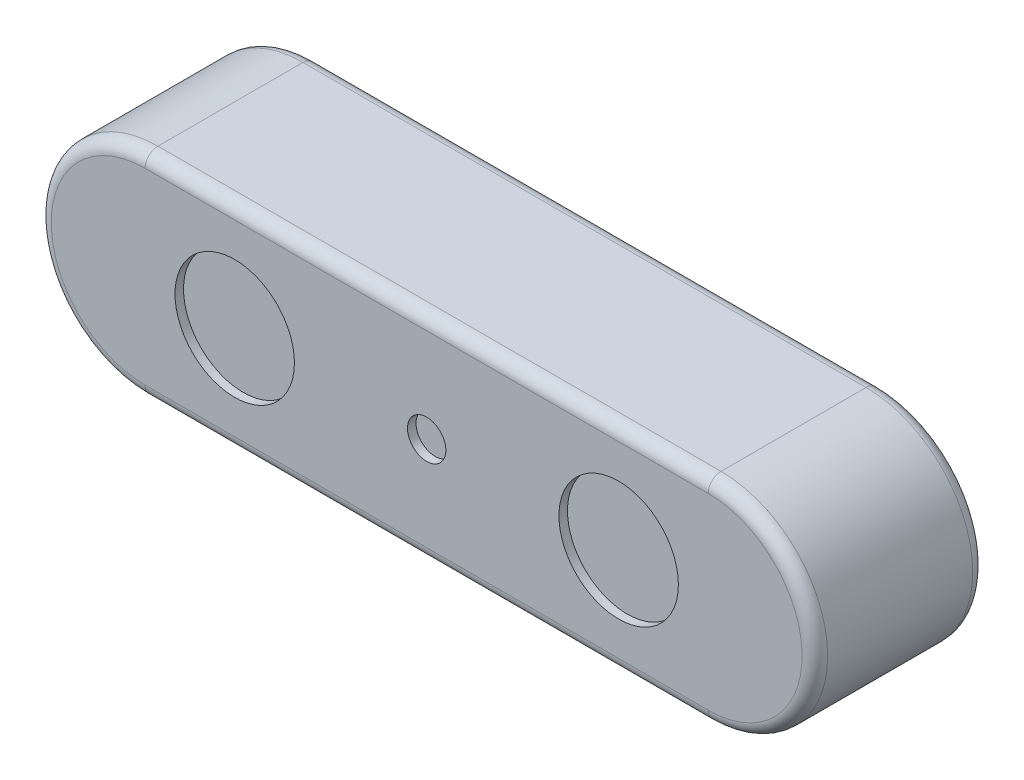
ISO-10303-21;
HEADER;
FILE_DESCRIPTION(('STEP AP214'),'2;1');
FILE_NAME('part.step','',(''),(''),'','','');
FILE_SCHEMA(('AUTOMOTIVE_DESIGN { 1 0 10303 214 1 1 1 1 }'));
ENDSEC;
DATA;
#1=APPLICATION_CONTEXT('core data for automotive mechanical design processes');
#2=APPLICATION_PROTOCOL_DEFINITION('international standard','automotive_design',2000,#1);
#3=PRODUCT_CONTEXT('',#1,'mechanical');
#4=PRODUCT('Part','Part','',(#3));
#5=PRODUCT_RELATED_PRODUCT_CATEGORY('part','',(#4));
#6=PRODUCT_DEFINITION_FORMATION('','',#4);
#7=PRODUCT_DEFINITION_CONTEXT('part definition',#1,'design');
#8=PRODUCT_DEFINITION('design','',#6,#7);
#9=PRODUCT_DEFINITION_SHAPE('','',#8);
#10=(LENGTH_UNIT() NAMED_UNIT(*) SI_UNIT(.MILLI.,.METRE.));
#11=(NAMED_UNIT(*) PLANE_ANGLE_UNIT() SI_UNIT($,.RADIAN.));
#12=(NAMED_UNIT(*) SI_UNIT($,.STERADIAN.) SOLID_ANGLE_UNIT());
#13=UNCERTAINTY_MEASURE_WITH_UNIT(LENGTH_MEASURE(1.E-05),#10,'distance_accuracy_value','');
#14=(GEOMETRIC_REPRESENTATION_CONTEXT(3) GLOBAL_UNCERTAINTY_ASSIGNED_CONTEXT((#13)) GLOBAL_UNIT_ASSIGNED_CONTEXT((#10,
#11,#12)) REPRESENTATION_CONTEXT('',''));
#15=CARTESIAN_POINT('',(0.,0.,0.));
#16=DIRECTION('',(0.,0.,1.));
#17=DIRECTION('',(1.,0.,0.));
#18=AXIS2_PLACEMENT_3D('',#15,#16,#17);
#19=CARTESIAN_POINT('',(33.,0.,20.));
#20=DIRECTION('',(0.,0.,-1.));
#21=DIRECTION('',(-1.,0.,0.));
#22=AXIS2_PLACEMENT_3D('',#19,#20,#21);
#23=CYLINDRICAL_SURFACE('',#22,12.5);
#24=DIRECTION('',(0.,0.,-1.));
#25=VECTOR('',#24,1.);
#26=CARTESIAN_POINT('',(33.,-12.5,20.));
#27=LINE('',#26,#25);
#28=CARTESIAN_POINT('',(33.,-12.5,18.5));
#29=VERTEX_POINT('',#28);
#30=CARTESIAN_POINT('',(33.,-12.5,1.5));
#31=VERTEX_POINT('',#30);
#32=EDGE_CURVE('E164',#29,#31,#27,.T.);
#33=ORIENTED_EDGE('',*,*,#32,.T.);
#34=CARTESIAN_POINT('',(33.,0.,1.5));
#35=DIRECTION('',(0.,0.,1.));
#36=DIRECTION('',(1.,0.,0.));
#37=AXIS2_PLACEMENT_3D('',#34,#35,#36);
#38=CIRCLE('',#37,12.5);
#39=CARTESIAN_POINT('',(33.,12.5,1.5));
#40=VERTEX_POINT('',#39);
#41=EDGE_CURVE('E126',#31,#40,#38,.T.);
#42=ORIENTED_EDGE('',*,*,#41,.T.);
#43=DIRECTION('',(0.,0.,-1.));
#44=VECTOR('',#43,1.);
#45=CARTESIAN_POINT('',(33.,12.5,20.));
#46=LINE('',#45,#44);
#47=CARTESIAN_POINT('',(33.,12.5,18.5));
#48=VERTEX_POINT('',#47);
#49=EDGE_CURVE('E109',#48,#40,#46,.T.);
#50=ORIENTED_EDGE('',*,*,#49,.F.);
#51=CARTESIAN_POINT('',(33.,0.,18.5));
#52=DIRECTION('',(0.,0.,1.));
#53=DIRECTION('',(1.,0.,0.));
#54=AXIS2_PLACEMENT_3D('',#51,#52,#53);
#55=CIRCLE('',#54,12.5);
#56=EDGE_CURVE('E123',#48,#29,#55,.F.);
#57=ORIENTED_EDGE('',*,*,#56,.T.);
#58=EDGE_LOOP('',(#33,#42,#50,#57));
#59=FACE_BOUND('',#58,.T.);
#60=ADVANCED_FACE('F40',(#59),#23,.T.);
#61=CARTESIAN_POINT('',(-33.,12.5,20.));
#62=DIRECTION('',(0.,-1.,0.));
#63=DIRECTION('',(0.,0.,-1.));
#64=AXIS2_PLACEMENT_3D('',#61,#62,#63);
#65=PLANE('',#64);
#66=ORIENTED_EDGE('',*,*,#49,.T.);
#67=DIRECTION('',(-1.,0.,0.));
#68=VECTOR('',#67,1.);
#69=CARTESIAN_POINT('',(-33.,12.5,1.5));
#70=LINE('',#69,#68);
#71=CARTESIAN_POINT('',(-33.,12.5,1.5));
#72=VERTEX_POINT('',#71);
#73=EDGE_CURVE('E11',#40,#72,#70,.T.);
#74=ORIENTED_EDGE('',*,*,#73,.T.);
#75=DIRECTION('',(0.,0.,-1.));
#76=VECTOR('',#75,1.);
#77=CARTESIAN_POINT('',(-33.,12.5,20.));
#78=LINE('',#77,#76);
#79=CARTESIAN_POINT('',(-33.,12.5,18.5));
#80=VERTEX_POINT('',#79);
#81=EDGE_CURVE('E111',#80,#72,#78,.T.);
#82=ORIENTED_EDGE('',*,*,#81,.F.);
#83=DIRECTION('',(-1.,0.,0.));
#84=VECTOR('',#83,1.);
#85=CARTESIAN_POINT('',(33.,12.5,18.5));
#86=LINE('',#85,#84);
#87=EDGE_CURVE('E49',#80,#48,#86,.F.);
#88=ORIENTED_EDGE('',*,*,#87,.T.);
#89=EDGE_LOOP('',(#66,#74,#82,#88));
#90=FACE_BOUND('',#89,.T.);
#91=ADVANCED_FACE('F108',(#90),#65,.F.);
#92=CARTESIAN_POINT('',(-33.,0.,20.));
#93=DIRECTION('',(0.,0.,-1.));
#94=DIRECTION('',(-1.,0.,0.));
#95=AXIS2_PLACEMENT_3D('',#92,#93,#94);
#96=CYLINDRICAL_SURFACE('',#95,12.5);
#97=ORIENTED_EDGE('',*,*,#81,.T.);
#98=CARTESIAN_POINT('',(-33.,0.,1.5));
#99=DIRECTION('',(0.,0.,1.));
#100=DIRECTION('',(1.,0.,0.));
#101=AXIS2_PLACEMENT_3D('',#98,#99,#100);
#102=CIRCLE('',#101,12.5);
#103=CARTESIAN_POINT('',(-33.,-12.5,1.5));
#104=VERTEX_POINT('',#103);
#105=EDGE_CURVE('E195',#72,#104,#102,.T.);
#106=ORIENTED_EDGE('',*,*,#105,.T.);
#107=DIRECTION('',(0.,0.,-1.));
#108=VECTOR('',#107,1.);
#109=CARTESIAN_POINT('',(-33.,-12.5,20.));
#110=LINE('',#109,#108);
#111=CARTESIAN_POINT('',(-33.,-12.5,18.5));
#112=VERTEX_POINT('',#111);
#113=EDGE_CURVE('E169',#112,#104,#110,.T.);
#114=ORIENTED_EDGE('',*,*,#113,.F.);
#115=CARTESIAN_POINT('',(-33.,0.,18.5));
#116=DIRECTION('',(0.,0.,1.));
#117=DIRECTION('',(1.,0.,0.));
#118=AXIS2_PLACEMENT_3D('',#115,#116,#117);
#119=CIRCLE('',#118,12.5);
#120=EDGE_CURVE('E193',#112,#80,#119,.F.);
#121=ORIENTED_EDGE('',*,*,#120,.T.);
#122=EDGE_LOOP('',(#97,#106,#114,#121));
#123=FACE_BOUND('',#122,.T.);
#124=ADVANCED_FACE('F208',(#123),#96,.T.);
#125=CARTESIAN_POINT('',(-33.,-12.5,20.));
#126=DIRECTION('',(0.,1.,0.));
#127=DIRECTION('',(0.,0.,1.));
#128=AXIS2_PLACEMENT_3D('',#125,#126,#127);
#129=PLANE('',#128);
#130=CARTESIAN_POINT('',(-17.5,-12.5,10.));
#131=DIRECTION('',(0.,-1.,0.));
#132=DIRECTION('',(0.,0.,-1.));
#133=AXIS2_PLACEMENT_3D('',#130,#131,#132);
#134=CIRCLE('',#133,1.5);
#135=CARTESIAN_POINT('',(-17.5,-12.5,8.5));
#136=VERTEX_POINT('',#135);
#137=EDGE_CURVE('E286',#136,#136,#134,.T.);
#138=ORIENTED_EDGE('',*,*,#137,.F.);
#139=EDGE_LOOP('',(#138));
#140=FACE_BOUND('',#139,.T.);
#141=CARTESIAN_POINT('',(16.5,-12.5,9.99999999999998));
#142=DIRECTION('',(0.,-1.,0.));
#143=DIRECTION('',(0.,0.,1.));
#144=AXIS2_PLACEMENT_3D('',#141,#142,#143);
#145=CIRCLE('',#144,1.5);
#146=CARTESIAN_POINT('',(16.5,-12.5,11.5));
#147=VERTEX_POINT('',#146);
#148=EDGE_CURVE('E296',#147,#147,#145,.T.);
#149=ORIENTED_EDGE('',*,*,#148,.F.);
#150=EDGE_LOOP('',(#149));
#151=FACE_BOUND('',#150,.T.);
#152=ORIENTED_EDGE('',*,*,#113,.T.);
#153=DIRECTION('',(1.,0.,0.));
#154=VECTOR('',#153,1.);
#155=CARTESIAN_POINT('',(-33.,-12.5,1.5));
#156=LINE('',#155,#154);
#157=EDGE_CURVE('E191',#104,#31,#156,.T.);
#158=ORIENTED_EDGE('',*,*,#157,.T.);
#159=ORIENTED_EDGE('',*,*,#32,.F.);
#160=DIRECTION('',(1.,0.,0.));
#161=VECTOR('',#160,1.);
#162=CARTESIAN_POINT('',(-33.,-12.5,18.5));
#163=LINE('',#162,#161);
#164=EDGE_CURVE('E189',#29,#112,#163,.F.);
#165=ORIENTED_EDGE('',*,*,#164,.T.);
#166=EDGE_LOOP('',(#152,#158,#159,#165));
#167=FACE_BOUND('',#166,.T.);
#168=ADVANCED_FACE('F206',(#140,#151,#167),#129,.F.);
#169=CARTESIAN_POINT('',(33.,0.,20.));
#170=DIRECTION('',(0.,0.,1.));
#171=DIRECTION('',(1.,0.,0.));
#172=AXIS2_PLACEMENT_3D('',#169,#170,#171);
#173=PLANE('',#172);
#174=CARTESIAN_POINT('',(-22.5,0.,20.));
#175=DIRECTION('',(0.,0.,1.));
#176=DIRECTION('',(1.,0.,0.));
#177=AXIS2_PLACEMENT_3D('',#174,#175,#176);
#178=CIRCLE('',#177,7.);
#179=CARTESIAN_POINT('',(-15.5,0.,20.));
#180=VERTEX_POINT('',#179);
#181=EDGE_CURVE('E143',#180,#180,#178,.T.);
#182=ORIENTED_EDGE('',*,*,#181,.F.);
#183=EDGE_LOOP('',(#182));
#184=FACE_BOUND('',#183,.T.);
#185=CARTESIAN_POINT('',(22.5,0.,20.));
#186=DIRECTION('',(0.,0.,1.));
#187=DIRECTION('',(1.,0.,0.));
#188=AXIS2_PLACEMENT_3D('',#185,#186,#187);
#189=CIRCLE('',#188,7.);
#190=CARTESIAN_POINT('',(29.5,0.,20.));
#191=VERTEX_POINT('',#190);
#192=EDGE_CURVE('E304',#191,#191,#189,.T.);
#193=ORIENTED_EDGE('',*,*,#192,.F.);
#194=EDGE_LOOP('',(#193));
#195=FACE_BOUND('',#194,.T.);
#196=CARTESIAN_POINT('',(0.,0.,20.));
#197=DIRECTION('',(0.,0.,1.));
#198=DIRECTION('',(1.,0.,0.));
#199=AXIS2_PLACEMENT_3D('',#196,#197,#198);
#200=CIRCLE('',#199,2.25);
#201=CARTESIAN_POINT('',(2.25,0.,20.));
#202=VERTEX_POINT('',#201);
#203=EDGE_CURVE('E175',#202,#202,#200,.T.);
#204=ORIENTED_EDGE('',*,*,#203,.F.);
#205=EDGE_LOOP('',(#204));
#206=FACE_BOUND('',#205,.T.);
#207=DIRECTION('',(1.,0.,0.));
#208=VECTOR('',#207,1.);
#209=CARTESIAN_POINT('',(33.,-11.,20.));
#210=LINE('',#209,#208);
#211=CARTESIAN_POINT('',(-33.,-11.,20.));
#212=VERTEX_POINT('',#211);
#213=CARTESIAN_POINT('',(33.,-11.,20.));
#214=VERTEX_POINT('',#213);
#215=EDGE_CURVE('E57',#212,#214,#210,.T.);
#216=ORIENTED_EDGE('',*,*,#215,.T.);
#217=CARTESIAN_POINT('',(33.,0.,20.));
#218=DIRECTION('',(0.,0.,1.));
#219=DIRECTION('',(1.,0.,0.));
#220=AXIS2_PLACEMENT_3D('',#217,#218,#219);
#221=CIRCLE('',#220,11.);
#222=CARTESIAN_POINT('',(33.,11.,20.));
#223=VERTEX_POINT('',#222);
#224=EDGE_CURVE('E116',#214,#223,#221,.T.);
#225=ORIENTED_EDGE('',*,*,#224,.T.);
#226=DIRECTION('',(-1.,0.,0.));
#227=VECTOR('',#226,1.);
#228=CARTESIAN_POINT('',(-33.,11.,20.));
#229=LINE('',#228,#227);
#230=CARTESIAN_POINT('',(-33.,11.,20.));
#231=VERTEX_POINT('',#230);
#232=EDGE_CURVE('E137',#223,#231,#229,.T.);
#233=ORIENTED_EDGE('',*,*,#232,.T.);
#234=CARTESIAN_POINT('',(-33.,0.,20.));
#235=DIRECTION('',(0.,0.,1.));
#236=DIRECTION('',(1.,0.,0.));
#237=AXIS2_PLACEMENT_3D('',#234,#235,#236);
#238=CIRCLE('',#237,11.);
#239=EDGE_CURVE('E62',#231,#212,#238,.T.);
#240=ORIENTED_EDGE('',*,*,#239,.T.);
#241=EDGE_LOOP('',(#216,#225,#233,#240));
#242=FACE_BOUND('',#241,.T.);
#243=ADVANCED_FACE('F200',(#184,#195,#206,#242),#173,.T.);
#244=CARTESIAN_POINT('',(33.,0.,0.));
#245=DIRECTION('',(0.,0.,1.));
#246=DIRECTION('',(1.,0.,0.));
#247=AXIS2_PLACEMENT_3D('',#244,#245,#246);
#248=PLANE('',#247);
#249=DIRECTION('',(-1.,0.,0.));
#250=VECTOR('',#249,1.);
#251=CARTESIAN_POINT('',(33.,11.,0.));
#252=LINE('',#251,#250);
#253=CARTESIAN_POINT('',(-33.,11.,0.));
#254=VERTEX_POINT('',#253);
#255=CARTESIAN_POINT('',(33.,11.,0.));
#256=VERTEX_POINT('',#255);
#257=EDGE_CURVE('E180',#254,#256,#252,.F.);
#258=ORIENTED_EDGE('',*,*,#257,.T.);
#259=CARTESIAN_POINT('',(33.,0.,0.));
#260=DIRECTION('',(0.,0.,1.));
#261=DIRECTION('',(1.,0.,0.));
#262=AXIS2_PLACEMENT_3D('',#259,#260,#261);
#263=CIRCLE('',#262,11.);
#264=CARTESIAN_POINT('',(33.,-11.,0.));
#265=VERTEX_POINT('',#264);
#266=EDGE_CURVE('E186',#256,#265,#263,.F.);
#267=ORIENTED_EDGE('',*,*,#266,.T.);
#268=DIRECTION('',(1.,0.,0.));
#269=VECTOR('',#268,1.);
#270=CARTESIAN_POINT('',(33.,-11.,0.));
#271=LINE('',#270,#269);
#272=CARTESIAN_POINT('',(-33.,-11.,0.));
#273=VERTEX_POINT('',#272);
#274=EDGE_CURVE('E184',#265,#273,#271,.F.);
#275=ORIENTED_EDGE('',*,*,#274,.T.);
#276=CARTESIAN_POINT('',(-33.,0.,0.));
#277=DIRECTION('',(0.,0.,1.));
#278=DIRECTION('',(1.,0.,0.));
#279=AXIS2_PLACEMENT_3D('',#276,#277,#278);
#280=CIRCLE('',#279,11.);
#281=EDGE_CURVE('E182',#273,#254,#280,.F.);
#282=ORIENTED_EDGE('',*,*,#281,.T.);
#283=EDGE_LOOP('',(#258,#267,#275,#282));
#284=FACE_BOUND('',#283,.T.);
#285=ADVANCED_FACE('F235',(#284),#248,.F.);
#286=CARTESIAN_POINT('',(-33.,0.,1.5));
#287=DIRECTION('',(0.,0.,1.));
#288=DIRECTION('',(1.,0.,0.));
#289=AXIS2_PLACEMENT_3D('',#286,#287,#288);
#290=TOROIDAL_SURFACE('',#289,11.,1.5);
#291=CARTESIAN_POINT('',(-33.,11.,1.5));
#292=DIRECTION('',(1.,0.,0.));
#293=DIRECTION('',(0.,0.,-1.));
#294=AXIS2_PLACEMENT_3D('',#291,#292,#293);
#295=CIRCLE('',#294,1.5);
#296=EDGE_CURVE('E157',#254,#72,#295,.T.);
#297=ORIENTED_EDGE('',*,*,#296,.F.);
#298=ORIENTED_EDGE('',*,*,#281,.F.);
#299=CARTESIAN_POINT('',(-33.,-11.,1.5));
#300=DIRECTION('',(1.,0.,0.));
#301=DIRECTION('',(0.,0.,-1.));
#302=AXIS2_PLACEMENT_3D('',#299,#300,#301);
#303=CIRCLE('',#302,1.5);
#304=EDGE_CURVE('E146',#104,#273,#303,.T.);
#305=ORIENTED_EDGE('',*,*,#304,.F.);
#306=ORIENTED_EDGE('',*,*,#105,.F.);
#307=EDGE_LOOP('',(#297,#298,#305,#306));
#308=FACE_BOUND('',#307,.T.);
#309=ADVANCED_FACE('F211',(#308),#290,.T.);
#310=CARTESIAN_POINT('',(-33.,-11.,1.5));
#311=DIRECTION('',(1.,0.,0.));
#312=DIRECTION('',(0.,0.,-1.));
#313=AXIS2_PLACEMENT_3D('',#310,#311,#312);
#314=CYLINDRICAL_SURFACE('',#313,1.5);
#315=ORIENTED_EDGE('',*,*,#304,.T.);
#316=ORIENTED_EDGE('',*,*,#274,.F.);
#317=CARTESIAN_POINT('',(33.,-11.,1.5));
#318=DIRECTION('',(1.,0.,0.));
#319=DIRECTION('',(0.,0.,-1.));
#320=AXIS2_PLACEMENT_3D('',#317,#318,#319);
#321=CIRCLE('',#320,1.5);
#322=EDGE_CURVE('E151',#31,#265,#321,.T.);
#323=ORIENTED_EDGE('',*,*,#322,.F.);
#324=ORIENTED_EDGE('',*,*,#157,.F.);
#325=EDGE_LOOP('',(#315,#316,#323,#324));
#326=FACE_BOUND('',#325,.T.);
#327=ADVANCED_FACE('F213',(#326),#314,.T.);
#328=CARTESIAN_POINT('',(-33.,11.,1.5));
#329=DIRECTION('',(-1.,0.,0.));
#330=DIRECTION('',(0.,0.,1.));
#331=AXIS2_PLACEMENT_3D('',#328,#329,#330);
#332=CYLINDRICAL_SURFACE('',#331,1.5);
#333=ORIENTED_EDGE('',*,*,#296,.T.);
#334=ORIENTED_EDGE('',*,*,#73,.F.);
#335=CARTESIAN_POINT('',(33.,11.,1.5));
#336=DIRECTION('',(1.,0.,0.));
#337=DIRECTION('',(0.,0.,-1.));
#338=AXIS2_PLACEMENT_3D('',#335,#336,#337);
#339=CIRCLE('',#338,1.5);
#340=EDGE_CURVE('E149',#256,#40,#339,.T.);
#341=ORIENTED_EDGE('',*,*,#340,.F.);
#342=ORIENTED_EDGE('',*,*,#257,.F.);
#343=EDGE_LOOP('',(#333,#334,#341,#342));
#344=FACE_BOUND('',#343,.T.);
#345=ADVANCED_FACE('F216',(#344),#332,.T.);
#346=CARTESIAN_POINT('',(33.,0.,1.5));
#347=DIRECTION('',(0.,0.,1.));
#348=DIRECTION('',(1.,0.,0.));
#349=AXIS2_PLACEMENT_3D('',#346,#347,#348);
#350=TOROIDAL_SURFACE('',#349,11.,1.5);
#351=ORIENTED_EDGE('',*,*,#322,.T.);
#352=ORIENTED_EDGE('',*,*,#266,.F.);
#353=ORIENTED_EDGE('',*,*,#340,.T.);
#354=ORIENTED_EDGE('',*,*,#41,.F.);
#355=EDGE_LOOP('',(#351,#352,#353,#354));
#356=FACE_BOUND('',#355,.T.);
#357=ADVANCED_FACE('F214',(#356),#350,.T.);
#358=CARTESIAN_POINT('',(-33.,0.,18.5));
#359=DIRECTION('',(0.,0.,1.));
#360=DIRECTION('',(1.,0.,0.));
#361=AXIS2_PLACEMENT_3D('',#358,#359,#360);
#362=TOROIDAL_SURFACE('',#361,11.,1.5);
#363=CARTESIAN_POINT('',(-33.,11.,18.5));
#364=DIRECTION('',(1.,0.,0.));
#365=DIRECTION('',(0.,0.,-1.));
#366=AXIS2_PLACEMENT_3D('',#363,#364,#365);
#367=CIRCLE('',#366,1.5);
#368=EDGE_CURVE('E140',#80,#231,#367,.T.);
#369=ORIENTED_EDGE('',*,*,#368,.F.);
#370=ORIENTED_EDGE('',*,*,#120,.F.);
#371=CARTESIAN_POINT('',(-33.,-11.,18.5));
#372=DIRECTION('',(1.,0.,0.));
#373=DIRECTION('',(0.,0.,-1.));
#374=AXIS2_PLACEMENT_3D('',#371,#372,#373);
#375=CIRCLE('',#374,1.5);
#376=EDGE_CURVE('E44',#212,#112,#375,.T.);
#377=ORIENTED_EDGE('',*,*,#376,.F.);
#378=ORIENTED_EDGE('',*,*,#239,.F.);
#379=EDGE_LOOP('',(#369,#370,#377,#378));
#380=FACE_BOUND('',#379,.T.);
#381=ADVANCED_FACE('F42',(#380),#362,.T.);
#382=CARTESIAN_POINT('',(33.,-11.,18.5));
#383=DIRECTION('',(-1.,0.,0.));
#384=DIRECTION('',(0.,0.,1.));
#385=AXIS2_PLACEMENT_3D('',#382,#383,#384);
#386=CYLINDRICAL_SURFACE('',#385,1.5);
#387=ORIENTED_EDGE('',*,*,#376,.T.);
#388=ORIENTED_EDGE('',*,*,#164,.F.);
#389=CARTESIAN_POINT('',(33.,-11.,18.5));
#390=DIRECTION('',(1.,0.,0.));
#391=DIRECTION('',(0.,0.,-1.));
#392=AXIS2_PLACEMENT_3D('',#389,#390,#391);
#393=CIRCLE('',#392,1.5);
#394=EDGE_CURVE('E133',#214,#29,#393,.T.);
#395=ORIENTED_EDGE('',*,*,#394,.F.);
#396=ORIENTED_EDGE('',*,*,#215,.F.);
#397=EDGE_LOOP('',(#387,#388,#395,#396));
#398=FACE_BOUND('',#397,.T.);
#399=ADVANCED_FACE('F203',(#398),#386,.T.);
#400=CARTESIAN_POINT('',(33.,11.,18.5));
#401=DIRECTION('',(1.,0.,0.));
#402=DIRECTION('',(0.,0.,-1.));
#403=AXIS2_PLACEMENT_3D('',#400,#401,#402);
#404=CYLINDRICAL_SURFACE('',#403,1.5);
#405=ORIENTED_EDGE('',*,*,#368,.T.);
#406=ORIENTED_EDGE('',*,*,#232,.F.);
#407=CARTESIAN_POINT('',(33.,11.,18.5));
#408=DIRECTION('',(1.,0.,0.));
#409=DIRECTION('',(0.,0.,-1.));
#410=AXIS2_PLACEMENT_3D('',#407,#408,#409);
#411=CIRCLE('',#410,1.5);
#412=EDGE_CURVE('E131',#48,#223,#411,.T.);
#413=ORIENTED_EDGE('',*,*,#412,.F.);
#414=ORIENTED_EDGE('',*,*,#87,.F.);
#415=EDGE_LOOP('',(#405,#406,#413,#414));
#416=FACE_BOUND('',#415,.T.);
#417=ADVANCED_FACE('F136',(#416),#404,.T.);
#418=CARTESIAN_POINT('',(33.,0.,18.5));
#419=DIRECTION('',(0.,0.,1.));
#420=DIRECTION('',(1.,0.,0.));
#421=AXIS2_PLACEMENT_3D('',#418,#419,#420);
#422=TOROIDAL_SURFACE('',#421,11.,1.5);
#423=ORIENTED_EDGE('',*,*,#394,.T.);
#424=ORIENTED_EDGE('',*,*,#56,.F.);
#425=ORIENTED_EDGE('',*,*,#412,.T.);
#426=ORIENTED_EDGE('',*,*,#224,.F.);
#427=EDGE_LOOP('',(#423,#424,#425,#426));
#428=FACE_BOUND('',#427,.T.);
#429=ADVANCED_FACE('F129',(#428),#422,.T.);
#430=CARTESIAN_POINT('',(0.,0.,19.));
#431=DIRECTION('',(0.,0.,1.));
#432=DIRECTION('',(1.,0.,0.));
#433=AXIS2_PLACEMENT_3D('',#430,#431,#432);
#434=CYLINDRICAL_SURFACE('',#433,2.25);
#435=CARTESIAN_POINT('',(0.,0.,19.));
#436=DIRECTION('',(0.,0.,1.));
#437=DIRECTION('',(1.,0.,0.));
#438=AXIS2_PLACEMENT_3D('',#435,#436,#437);
#439=CIRCLE('',#438,2.25);
#440=CARTESIAN_POINT('',(2.25,0.,19.));
#441=VERTEX_POINT('',#440);
#442=EDGE_CURVE('E289',#441,#441,#439,.T.);
#443=ORIENTED_EDGE('',*,*,#442,.F.);
#444=EDGE_LOOP('',(#443));
#445=FACE_BOUND('',#444,.T.);
#446=ORIENTED_EDGE('',*,*,#203,.T.);
#447=EDGE_LOOP('',(#446));
#448=FACE_BOUND('',#447,.T.);
#449=ADVANCED_FACE('F242',(#445,#448),#434,.F.);
#450=CARTESIAN_POINT('',(0.,0.,19.));
#451=DIRECTION('',(0.,0.,1.));
#452=DIRECTION('',(1.,0.,0.));
#453=AXIS2_PLACEMENT_3D('',#450,#451,#452);
#454=PLANE('',#453);
#455=ORIENTED_EDGE('',*,*,#442,.T.);
#456=EDGE_LOOP('',(#455));
#457=FACE_BOUND('',#456,.T.);
#458=ADVANCED_FACE('F245',(#457),#454,.T.);
#459=CARTESIAN_POINT('',(22.5,0.,19.));
#460=DIRECTION('',(0.,0.,1.));
#461=DIRECTION('',(1.,0.,0.));
#462=AXIS2_PLACEMENT_3D('',#459,#460,#461);
#463=CYLINDRICAL_SURFACE('',#462,7.);
#464=CARTESIAN_POINT('',(22.5,0.,19.));
#465=DIRECTION('',(0.,0.,1.));
#466=DIRECTION('',(1.,0.,0.));
#467=AXIS2_PLACEMENT_3D('',#464,#465,#466);
#468=CIRCLE('',#467,7.);
#469=CARTESIAN_POINT('',(29.5,0.,19.));
#470=VERTEX_POINT('',#469);
#471=EDGE_CURVE('E301',#470,#470,#468,.T.);
#472=ORIENTED_EDGE('',*,*,#471,.F.);
#473=EDGE_LOOP('',(#472));
#474=FACE_BOUND('',#473,.T.);
#475=ORIENTED_EDGE('',*,*,#192,.T.);
#476=EDGE_LOOP('',(#475));
#477=FACE_BOUND('',#476,.T.);
#478=ADVANCED_FACE('F249',(#474,#477),#463,.F.);
#479=CARTESIAN_POINT('',(22.5,0.,19.));
#480=DIRECTION('',(0.,0.,1.));
#481=DIRECTION('',(1.,0.,0.));
#482=AXIS2_PLACEMENT_3D('',#479,#480,#481);
#483=PLANE('',#482);
#484=ORIENTED_EDGE('',*,*,#471,.T.);
#485=EDGE_LOOP('',(#484));
#486=FACE_BOUND('',#485,.T.);
#487=ADVANCED_FACE('F253',(#486),#483,.T.);
#488=CARTESIAN_POINT('',(-22.5,0.,19.));
#489=DIRECTION('',(0.,0.,1.));
#490=DIRECTION('',(1.,0.,0.));
#491=AXIS2_PLACEMENT_3D('',#488,#489,#490);
#492=CYLINDRICAL_SURFACE('',#491,7.);
#493=CARTESIAN_POINT('',(-22.5,0.,19.));
#494=DIRECTION('',(0.,0.,1.));
#495=DIRECTION('',(1.,0.,0.));
#496=AXIS2_PLACEMENT_3D('',#493,#494,#495);
#497=CIRCLE('',#496,7.);
#498=CARTESIAN_POINT('',(-15.5,0.,19.));
#499=VERTEX_POINT('',#498);
#500=EDGE_CURVE('E138',#499,#499,#497,.T.);
#501=ORIENTED_EDGE('',*,*,#500,.F.);
#502=EDGE_LOOP('',(#501));
#503=FACE_BOUND('',#502,.T.);
#504=ORIENTED_EDGE('',*,*,#181,.T.);
#505=EDGE_LOOP('',(#504));
#506=FACE_BOUND('',#505,.T.);
#507=ADVANCED_FACE('F257',(#503,#506),#492,.F.);
#508=CARTESIAN_POINT('',(-22.5,0.,19.));
#509=DIRECTION('',(0.,0.,1.));
#510=DIRECTION('',(1.,0.,0.));
#511=AXIS2_PLACEMENT_3D('',#508,#509,#510);
#512=PLANE('',#511);
#513=ORIENTED_EDGE('',*,*,#500,.T.);
#514=EDGE_LOOP('',(#513));
#515=FACE_BOUND('',#514,.T.);
#516=ADVANCED_FACE('F261',(#515),#512,.T.);
#517=CARTESIAN_POINT('',(16.5,-9.50000000000001,9.99999999999998));
#518=DIRECTION('',(0.,-1.,0.));
#519=DIRECTION('',(0.,0.,-1.));
#520=AXIS2_PLACEMENT_3D('',#517,#518,#519);
#521=CYLINDRICAL_SURFACE('',#520,1.5);
#522=CARTESIAN_POINT('',(16.5,-9.50000000000001,9.99999999999998));
#523=DIRECTION('',(0.,-1.,0.));
#524=DIRECTION('',(0.,0.,1.));
#525=AXIS2_PLACEMENT_3D('',#522,#523,#524);
#526=CIRCLE('',#525,1.5);
#527=CARTESIAN_POINT('',(16.5,-9.50000000000001,11.5));
#528=VERTEX_POINT('',#527);
#529=EDGE_CURVE('E291',#528,#528,#526,.T.);
#530=ORIENTED_EDGE('',*,*,#529,.F.);
#531=EDGE_LOOP('',(#530));
#532=FACE_BOUND('',#531,.T.);
#533=ORIENTED_EDGE('',*,*,#148,.T.);
#534=EDGE_LOOP('',(#533));
#535=FACE_BOUND('',#534,.T.);
#536=ADVANCED_FACE('F265',(#532,#535),#521,.F.);
#537=CARTESIAN_POINT('',(16.5,-9.50000000000001,9.99999999999998));
#538=DIRECTION('',(0.,1.,0.));
#539=DIRECTION('',(0.,0.,1.));
#540=AXIS2_PLACEMENT_3D('',#537,#538,#539);
#541=PLANE('',#540);
#542=ORIENTED_EDGE('',*,*,#529,.T.);
#543=EDGE_LOOP('',(#542));
#544=FACE_BOUND('',#543,.T.);
#545=ADVANCED_FACE('F269',(#544),#541,.F.);
#546=CARTESIAN_POINT('',(-17.5,-9.50000000000001,10.));
#547=DIRECTION('',(0.,-1.,0.));
#548=DIRECTION('',(0.,0.,-1.));
#549=AXIS2_PLACEMENT_3D('',#546,#547,#548);
#550=CYLINDRICAL_SURFACE('',#549,1.5);
#551=CARTESIAN_POINT('',(-17.5,-9.50000000000001,10.));
#552=DIRECTION('',(0.,-1.,0.));
#553=DIRECTION('',(0.,0.,-1.));
#554=AXIS2_PLACEMENT_3D('',#551,#552,#553);
#555=CIRCLE('',#554,1.5);
#556=CARTESIAN_POINT('',(-17.5,-9.50000000000001,8.5));
#557=VERTEX_POINT('',#556);
#558=EDGE_CURVE('E285',#557,#557,#555,.T.);
#559=ORIENTED_EDGE('',*,*,#558,.F.);
#560=EDGE_LOOP('',(#559));
#561=FACE_BOUND('',#560,.T.);
#562=ORIENTED_EDGE('',*,*,#137,.T.);
#563=EDGE_LOOP('',(#562));
#564=FACE_BOUND('',#563,.T.);
#565=ADVANCED_FACE('F273',(#561,#564),#550,.F.);
#566=CARTESIAN_POINT('',(-17.5,-9.50000000000001,10.));
#567=DIRECTION('',(0.,-1.,0.));
#568=DIRECTION('',(0.,0.,-1.));
#569=AXIS2_PLACEMENT_3D('',#566,#567,#568);
#570=PLANE('',#569);
#571=ORIENTED_EDGE('',*,*,#558,.T.);
#572=EDGE_LOOP('',(#571));
#573=FACE_BOUND('',#572,.T.);
#574=ADVANCED_FACE('F277',(#573),#570,.T.);
#575=CLOSED_SHELL('',(#60,#91,#124,#168,#243,#285,#309,#327,#345,#357,#381,#399,#417,#429,#449,
#458,#478,#487,#507,#516,#536,#545,#565,#574));
#576=MANIFOLD_SOLID_BREP('B2',#575);
#577=ADVANCED_BREP_SHAPE_REPRESENTATION('',(#18,#576),#14);
#578=SHAPE_DEFINITION_REPRESENTATION(#9,#577);
ENDSEC;
END-ISO-10303-21;
